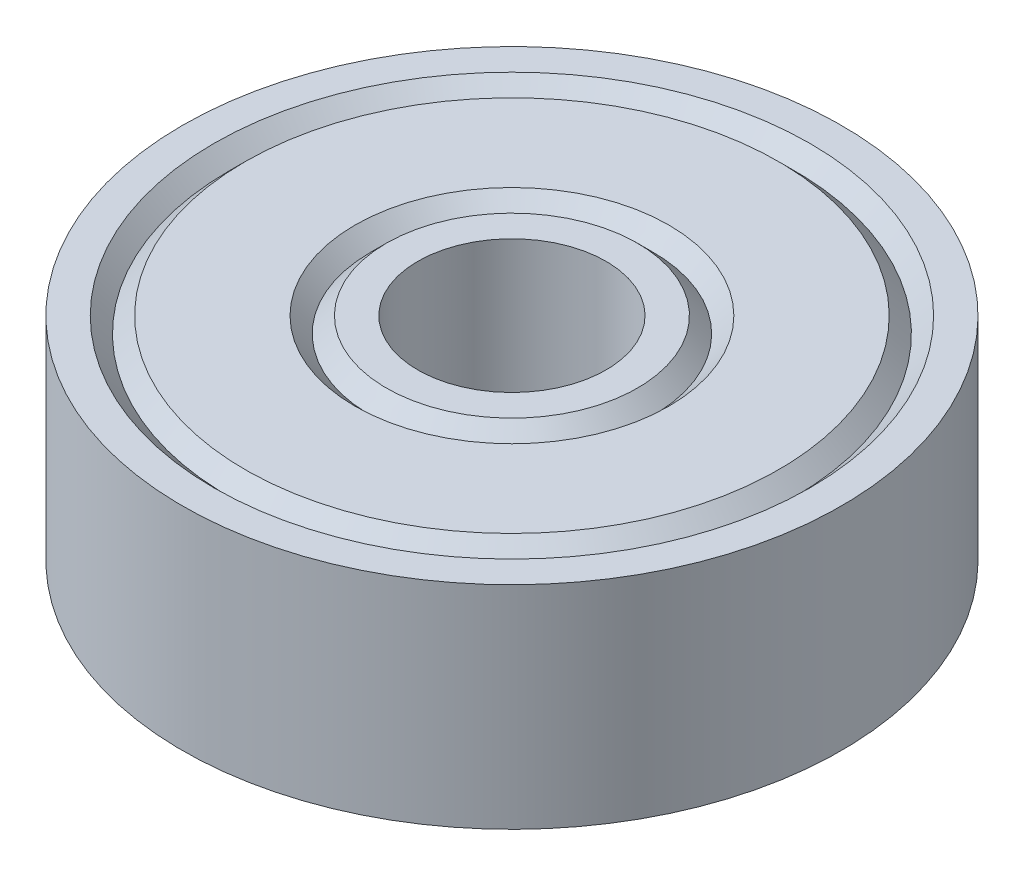
ISO-10303-21;
HEADER;
FILE_DESCRIPTION(('STEP AP214'),'2;1');
FILE_NAME('part.step','',(''),(''),'','','');
FILE_SCHEMA(('AUTOMOTIVE_DESIGN { 1 0 10303 214 1 1 1 1 }'));
ENDSEC;
DATA;
#1=APPLICATION_CONTEXT('core data for automotive mechanical design processes');
#2=APPLICATION_PROTOCOL_DEFINITION('international standard','automotive_design',2000,#1);
#3=PRODUCT_CONTEXT('',#1,'mechanical');
#4=PRODUCT('Part','Part','',(#3));
#5=PRODUCT_RELATED_PRODUCT_CATEGORY('part','',(#4));
#6=PRODUCT_DEFINITION_FORMATION('','',#4);
#7=PRODUCT_DEFINITION_CONTEXT('part definition',#1,'design');
#8=PRODUCT_DEFINITION('design','',#6,#7);
#9=PRODUCT_DEFINITION_SHAPE('','',#8);
#10=(LENGTH_UNIT() NAMED_UNIT(*) SI_UNIT(.MILLI.,.METRE.));
#11=(NAMED_UNIT(*) PLANE_ANGLE_UNIT() SI_UNIT($,.RADIAN.));
#12=(NAMED_UNIT(*) SI_UNIT($,.STERADIAN.) SOLID_ANGLE_UNIT());
#13=UNCERTAINTY_MEASURE_WITH_UNIT(LENGTH_MEASURE(1.E-05),#10,'distance_accuracy_value','');
#14=(GEOMETRIC_REPRESENTATION_CONTEXT(3) GLOBAL_UNCERTAINTY_ASSIGNED_CONTEXT((#13)) GLOBAL_UNIT_ASSIGNED_CONTEXT((#10,
#11,#12)) REPRESENTATION_CONTEXT('',''));
#15=CARTESIAN_POINT('',(0.,0.,0.));
#16=DIRECTION('',(0.,0.,1.));
#17=DIRECTION('',(1.,0.,0.));
#18=AXIS2_PLACEMENT_3D('',#15,#16,#17);
#19=CARTESIAN_POINT('',(0.,4.5,0.));
#20=DIRECTION('',(0.,1.,0.));
#21=DIRECTION('',(-1.,0.,0.));
#22=AXIS2_PLACEMENT_3D('',#19,#20,#21);
#23=CYLINDRICAL_SURFACE('',#22,4.);
#24=CARTESIAN_POINT('',(0.,4.50000000000001,0.));
#25=DIRECTION('',(0.,1.,0.));
#26=DIRECTION('',(-1.,0.,0.));
#27=AXIS2_PLACEMENT_3D('',#24,#25,#26);
#28=CIRCLE('',#27,4.);
#29=CARTESIAN_POINT('',(-4.,4.50000000000001,0.));
#30=VERTEX_POINT('',#29);
#31=EDGE_CURVE('E83',#30,#30,#28,.T.);
#32=ORIENTED_EDGE('',*,*,#31,.T.);
#33=EDGE_LOOP('',(#32));
#34=FACE_BOUND('',#33,.T.);
#35=CARTESIAN_POINT('',(0.,-4.5,0.));
#36=DIRECTION('',(0.,1.,0.));
#37=DIRECTION('',(-1.,0.,0.));
#38=AXIS2_PLACEMENT_3D('',#35,#36,#37);
#39=CIRCLE('',#38,4.);
#40=CARTESIAN_POINT('',(-4.,-4.5,0.));
#41=VERTEX_POINT('',#40);
#42=EDGE_CURVE('E10',#41,#41,#39,.T.);
#43=ORIENTED_EDGE('',*,*,#42,.F.);
#44=EDGE_LOOP('',(#43));
#45=FACE_BOUND('',#44,.T.);
#46=ADVANCED_FACE('F31',(#34,#45),#23,.F.);
#47=CARTESIAN_POINT('',(-4.,-4.5,0.));
#48=DIRECTION('',(0.,-1.,0.));
#49=DIRECTION('',(1.,0.,0.));
#50=AXIS2_PLACEMENT_3D('',#47,#48,#49);
#51=PLANE('',#50);
#52=ORIENTED_EDGE('',*,*,#42,.T.);
#53=EDGE_LOOP('',(#52));
#54=FACE_BOUND('',#53,.T.);
#55=CARTESIAN_POINT('',(0.,-4.49999999999999,0.));
#56=DIRECTION('',(0.,1.,0.));
#57=DIRECTION('',(-1.,0.,0.));
#58=AXIS2_PLACEMENT_3D('',#55,#56,#57);
#59=CIRCLE('',#58,5.33333333333333);
#60=CARTESIAN_POINT('',(-5.33333333333333,-4.49999999999999,0.));
#61=VERTEX_POINT('',#60);
#62=EDGE_CURVE('E37',#61,#61,#59,.T.);
#63=ORIENTED_EDGE('',*,*,#62,.F.);
#64=EDGE_LOOP('',(#63));
#65=FACE_BOUND('',#64,.T.);
#66=ADVANCED_FACE('F101',(#54,#65),#51,.T.);
#67=CARTESIAN_POINT('',(0.,-3.83333333333333,0.));
#68=DIRECTION('',(0.,1.,0.));
#69=DIRECTION('',(-1.,0.,0.));
#70=AXIS2_PLACEMENT_3D('',#67,#68,#69);
#71=CONICAL_SURFACE('',#70,5.99999999999999,0.78539816339745);
#72=ORIENTED_EDGE('',*,*,#62,.T.);
#73=EDGE_LOOP('',(#72));
#74=FACE_BOUND('',#73,.T.);
#75=CARTESIAN_POINT('',(0.,-3.83333333333333,0.));
#76=DIRECTION('',(0.,1.,0.));
#77=DIRECTION('',(-1.,0.,0.));
#78=AXIS2_PLACEMENT_3D('',#75,#76,#77);
#79=CIRCLE('',#78,5.99999999999999);
#80=CARTESIAN_POINT('',(-5.99999999999999,-3.83333333333333,0.));
#81=VERTEX_POINT('',#80);
#82=EDGE_CURVE('E41',#81,#81,#79,.T.);
#83=ORIENTED_EDGE('',*,*,#82,.F.);
#84=EDGE_LOOP('',(#83));
#85=FACE_BOUND('',#84,.T.);
#86=ADVANCED_FACE('F105',(#74,#85),#71,.T.);
#87=CARTESIAN_POINT('',(0.,-4.5,0.));
#88=DIRECTION('',(0.,-1.,0.));
#89=DIRECTION('',(1.,0.,0.));
#90=AXIS2_PLACEMENT_3D('',#87,#88,#89);
#91=CONICAL_SURFACE('',#90,6.66666666666666,0.785398163397448);
#92=ORIENTED_EDGE('',*,*,#82,.T.);
#93=EDGE_LOOP('',(#92));
#94=FACE_BOUND('',#93,.T.);
#95=CARTESIAN_POINT('',(0.,-4.5,0.));
#96=DIRECTION('',(0.,1.,0.));
#97=DIRECTION('',(-1.,0.,0.));
#98=AXIS2_PLACEMENT_3D('',#95,#96,#97);
#99=CIRCLE('',#98,6.66666666666666);
#100=CARTESIAN_POINT('',(-6.66666666666666,-4.5,0.));
#101=VERTEX_POINT('',#100);
#102=EDGE_CURVE('E45',#101,#101,#99,.T.);
#103=ORIENTED_EDGE('',*,*,#102,.F.);
#104=EDGE_LOOP('',(#103));
#105=FACE_BOUND('',#104,.T.);
#106=ADVANCED_FACE('F109',(#94,#105),#91,.F.);
#107=CARTESIAN_POINT('',(-6.66666666666666,-4.5,0.));
#108=DIRECTION('',(0.,-1.,0.));
#109=DIRECTION('',(1.,0.,0.));
#110=AXIS2_PLACEMENT_3D('',#107,#108,#109);
#111=PLANE('',#110);
#112=ORIENTED_EDGE('',*,*,#102,.T.);
#113=EDGE_LOOP('',(#112));
#114=FACE_BOUND('',#113,.T.);
#115=CARTESIAN_POINT('',(0.,-4.50000000000001,0.));
#116=DIRECTION('',(0.,1.,0.));
#117=DIRECTION('',(-1.,0.,0.));
#118=AXIS2_PLACEMENT_3D('',#115,#116,#117);
#119=CIRCLE('',#118,11.3333333333333);
#120=CARTESIAN_POINT('',(-11.3333333333333,-4.50000000000001,0.));
#121=VERTEX_POINT('',#120);
#122=EDGE_CURVE('E50',#121,#121,#119,.T.);
#123=ORIENTED_EDGE('',*,*,#122,.F.);
#124=EDGE_LOOP('',(#123));
#125=FACE_BOUND('',#124,.T.);
#126=ADVANCED_FACE('F115',(#114,#125),#111,.T.);
#127=CARTESIAN_POINT('',(0.,-3.83333333333334,0.));
#128=DIRECTION('',(0.,1.,0.));
#129=DIRECTION('',(-1.,0.,0.));
#130=AXIS2_PLACEMENT_3D('',#127,#128,#129);
#131=CONICAL_SURFACE('',#130,12.,0.785398163397448);
#132=ORIENTED_EDGE('',*,*,#122,.T.);
#133=EDGE_LOOP('',(#132));
#134=FACE_BOUND('',#133,.T.);
#135=CARTESIAN_POINT('',(0.,-3.83333333333334,0.));
#136=DIRECTION('',(0.,1.,0.));
#137=DIRECTION('',(-1.,0.,0.));
#138=AXIS2_PLACEMENT_3D('',#135,#136,#137);
#139=CIRCLE('',#138,12.);
#140=CARTESIAN_POINT('',(-12.,-3.83333333333333,0.));
#141=VERTEX_POINT('',#140);
#142=EDGE_CURVE('E53',#141,#141,#139,.T.);
#143=ORIENTED_EDGE('',*,*,#142,.F.);
#144=EDGE_LOOP('',(#143));
#145=FACE_BOUND('',#144,.T.);
#146=ADVANCED_FACE('F119',(#134,#145),#131,.T.);
#147=CARTESIAN_POINT('',(0.,-4.5,0.));
#148=DIRECTION('',(0.,-1.,0.));
#149=DIRECTION('',(1.,0.,0.));
#150=AXIS2_PLACEMENT_3D('',#147,#148,#149);
#151=CONICAL_SURFACE('',#150,12.6666666666667,0.785398163397446);
#152=ORIENTED_EDGE('',*,*,#142,.T.);
#153=EDGE_LOOP('',(#152));
#154=FACE_BOUND('',#153,.T.);
#155=CARTESIAN_POINT('',(0.,-4.5,0.));
#156=DIRECTION('',(0.,1.,0.));
#157=DIRECTION('',(-1.,0.,0.));
#158=AXIS2_PLACEMENT_3D('',#155,#156,#157);
#159=CIRCLE('',#158,12.6666666666667);
#160=CARTESIAN_POINT('',(-12.6666666666667,-4.5,0.));
#161=VERTEX_POINT('',#160);
#162=EDGE_CURVE('E56',#161,#161,#159,.T.);
#163=ORIENTED_EDGE('',*,*,#162,.F.);
#164=EDGE_LOOP('',(#163));
#165=FACE_BOUND('',#164,.T.);
#166=ADVANCED_FACE('F123',(#154,#165),#151,.F.);
#167=CARTESIAN_POINT('',(-12.6666666666667,-4.5,0.));
#168=DIRECTION('',(0.,-1.,0.));
#169=DIRECTION('',(1.,0.,0.));
#170=AXIS2_PLACEMENT_3D('',#167,#168,#169);
#171=PLANE('',#170);
#172=ORIENTED_EDGE('',*,*,#162,.T.);
#173=EDGE_LOOP('',(#172));
#174=FACE_BOUND('',#173,.T.);
#175=CARTESIAN_POINT('',(0.,-4.5,0.));
#176=DIRECTION('',(0.,1.,0.));
#177=DIRECTION('',(-1.,0.,0.));
#178=AXIS2_PLACEMENT_3D('',#175,#176,#177);
#179=CIRCLE('',#178,14.);
#180=CARTESIAN_POINT('',(-14.,-4.5,0.));
#181=VERTEX_POINT('',#180);
#182=EDGE_CURVE('E59',#181,#181,#179,.T.);
#183=ORIENTED_EDGE('',*,*,#182,.F.);
#184=EDGE_LOOP('',(#183));
#185=FACE_BOUND('',#184,.T.);
#186=ADVANCED_FACE('F127',(#174,#185),#171,.T.);
#187=CARTESIAN_POINT('',(0.,4.5,0.));
#188=DIRECTION('',(0.,1.,0.));
#189=DIRECTION('',(-1.,0.,0.));
#190=AXIS2_PLACEMENT_3D('',#187,#188,#189);
#191=CYLINDRICAL_SURFACE('',#190,14.);
#192=ORIENTED_EDGE('',*,*,#182,.T.);
#193=EDGE_LOOP('',(#192));
#194=FACE_BOUND('',#193,.T.);
#195=CARTESIAN_POINT('',(0.,4.5,0.));
#196=DIRECTION('',(0.,1.,0.));
#197=DIRECTION('',(-1.,0.,0.));
#198=AXIS2_PLACEMENT_3D('',#195,#196,#197);
#199=CIRCLE('',#198,14.);
#200=CARTESIAN_POINT('',(-14.,4.5,0.));
#201=VERTEX_POINT('',#200);
#202=EDGE_CURVE('E62',#201,#201,#199,.T.);
#203=ORIENTED_EDGE('',*,*,#202,.F.);
#204=EDGE_LOOP('',(#203));
#205=FACE_BOUND('',#204,.T.);
#206=ADVANCED_FACE('F131',(#194,#205),#191,.T.);
#207=CARTESIAN_POINT('',(-12.6666666666667,4.5,0.));
#208=DIRECTION('',(0.,1.,0.));
#209=DIRECTION('',(-1.,0.,0.));
#210=AXIS2_PLACEMENT_3D('',#207,#208,#209);
#211=PLANE('',#210);
#212=ORIENTED_EDGE('',*,*,#202,.T.);
#213=EDGE_LOOP('',(#212));
#214=FACE_BOUND('',#213,.T.);
#215=CARTESIAN_POINT('',(0.,4.5,0.));
#216=DIRECTION('',(0.,1.,0.));
#217=DIRECTION('',(-1.,0.,0.));
#218=AXIS2_PLACEMENT_3D('',#215,#216,#217);
#219=CIRCLE('',#218,12.6666666666667);
#220=CARTESIAN_POINT('',(-12.6666666666667,4.5,0.));
#221=VERTEX_POINT('',#220);
#222=EDGE_CURVE('E65',#221,#221,#219,.T.);
#223=ORIENTED_EDGE('',*,*,#222,.F.);
#224=EDGE_LOOP('',(#223));
#225=FACE_BOUND('',#224,.T.);
#226=ADVANCED_FACE('F135',(#214,#225),#211,.T.);
#227=CARTESIAN_POINT('',(0.,3.83333333333333,0.));
#228=DIRECTION('',(0.,1.,0.));
#229=DIRECTION('',(-1.,0.,0.));
#230=AXIS2_PLACEMENT_3D('',#227,#228,#229);
#231=CONICAL_SURFACE('',#230,12.,0.785398163397446);
#232=ORIENTED_EDGE('',*,*,#222,.T.);
#233=EDGE_LOOP('',(#232));
#234=FACE_BOUND('',#233,.T.);
#235=CARTESIAN_POINT('',(0.,3.83333333333333,0.));
#236=DIRECTION('',(0.,1.,0.));
#237=DIRECTION('',(-1.,0.,0.));
#238=AXIS2_PLACEMENT_3D('',#235,#236,#237);
#239=CIRCLE('',#238,12.);
#240=CARTESIAN_POINT('',(-12.,3.83333333333333,0.));
#241=VERTEX_POINT('',#240);
#242=EDGE_CURVE('E68',#241,#241,#239,.T.);
#243=ORIENTED_EDGE('',*,*,#242,.F.);
#244=EDGE_LOOP('',(#243));
#245=FACE_BOUND('',#244,.T.);
#246=ADVANCED_FACE('F139',(#234,#245),#231,.F.);
#247=CARTESIAN_POINT('',(0.,4.50000000000001,0.));
#248=DIRECTION('',(0.,-1.,0.));
#249=DIRECTION('',(1.,0.,0.));
#250=AXIS2_PLACEMENT_3D('',#247,#248,#249);
#251=CONICAL_SURFACE('',#250,11.3333333333333,0.785398163397448);
#252=ORIENTED_EDGE('',*,*,#242,.T.);
#253=EDGE_LOOP('',(#252));
#254=FACE_BOUND('',#253,.T.);
#255=CARTESIAN_POINT('',(0.,4.50000000000001,0.));
#256=DIRECTION('',(0.,1.,0.));
#257=DIRECTION('',(-1.,0.,0.));
#258=AXIS2_PLACEMENT_3D('',#255,#256,#257);
#259=CIRCLE('',#258,11.3333333333333);
#260=CARTESIAN_POINT('',(-11.3333333333333,4.50000000000001,0.));
#261=VERTEX_POINT('',#260);
#262=EDGE_CURVE('E71',#261,#261,#259,.T.);
#263=ORIENTED_EDGE('',*,*,#262,.F.);
#264=EDGE_LOOP('',(#263));
#265=FACE_BOUND('',#264,.T.);
#266=ADVANCED_FACE('F143',(#254,#265),#251,.T.);
#267=CARTESIAN_POINT('',(-6.66666666666666,4.5,0.));
#268=DIRECTION('',(0.,1.,0.));
#269=DIRECTION('',(-1.,0.,0.));
#270=AXIS2_PLACEMENT_3D('',#267,#268,#269);
#271=PLANE('',#270);
#272=ORIENTED_EDGE('',*,*,#262,.T.);
#273=EDGE_LOOP('',(#272));
#274=FACE_BOUND('',#273,.T.);
#275=CARTESIAN_POINT('',(0.,4.5,0.));
#276=DIRECTION('',(0.,1.,0.));
#277=DIRECTION('',(-1.,0.,0.));
#278=AXIS2_PLACEMENT_3D('',#275,#276,#277);
#279=CIRCLE('',#278,6.66666666666666);
#280=CARTESIAN_POINT('',(-6.66666666666666,4.5,0.));
#281=VERTEX_POINT('',#280);
#282=EDGE_CURVE('E74',#281,#281,#279,.T.);
#283=ORIENTED_EDGE('',*,*,#282,.F.);
#284=EDGE_LOOP('',(#283));
#285=FACE_BOUND('',#284,.T.);
#286=ADVANCED_FACE('F147',(#274,#285),#271,.T.);
#287=CARTESIAN_POINT('',(0.,3.83333333333333,0.));
#288=DIRECTION('',(0.,1.,0.));
#289=DIRECTION('',(-1.,0.,0.));
#290=AXIS2_PLACEMENT_3D('',#287,#288,#289);
#291=CONICAL_SURFACE('',#290,6.,0.785398163397449);
#292=ORIENTED_EDGE('',*,*,#282,.T.);
#293=EDGE_LOOP('',(#292));
#294=FACE_BOUND('',#293,.T.);
#295=CARTESIAN_POINT('',(0.,3.83333333333333,0.));
#296=DIRECTION('',(0.,1.,0.));
#297=DIRECTION('',(-1.,0.,0.));
#298=AXIS2_PLACEMENT_3D('',#295,#296,#297);
#299=CIRCLE('',#298,6.);
#300=CARTESIAN_POINT('',(-5.99999999999999,3.83333333333333,0.));
#301=VERTEX_POINT('',#300);
#302=EDGE_CURVE('E77',#301,#301,#299,.T.);
#303=ORIENTED_EDGE('',*,*,#302,.F.);
#304=EDGE_LOOP('',(#303));
#305=FACE_BOUND('',#304,.T.);
#306=ADVANCED_FACE('F97',(#294,#305),#291,.F.);
#307=CARTESIAN_POINT('',(0.,4.5,0.));
#308=DIRECTION('',(0.,-1.,0.));
#309=DIRECTION('',(1.,0.,0.));
#310=AXIS2_PLACEMENT_3D('',#307,#308,#309);
#311=CONICAL_SURFACE('',#310,5.33333333333333,0.785398163397448);
#312=ORIENTED_EDGE('',*,*,#302,.T.);
#313=EDGE_LOOP('',(#312));
#314=FACE_BOUND('',#313,.T.);
#315=CARTESIAN_POINT('',(0.,4.5,0.));
#316=DIRECTION('',(0.,1.,0.));
#317=DIRECTION('',(-1.,0.,0.));
#318=AXIS2_PLACEMENT_3D('',#315,#316,#317);
#319=CIRCLE('',#318,5.33333333333333);
#320=CARTESIAN_POINT('',(-5.33333333333333,4.5,0.));
#321=VERTEX_POINT('',#320);
#322=EDGE_CURVE('E80',#321,#321,#319,.T.);
#323=ORIENTED_EDGE('',*,*,#322,.F.);
#324=EDGE_LOOP('',(#323));
#325=FACE_BOUND('',#324,.T.);
#326=ADVANCED_FACE('F91',(#314,#325),#311,.T.);
#327=CARTESIAN_POINT('',(-4.,4.5,0.));
#328=DIRECTION('',(0.,1.,0.));
#329=DIRECTION('',(-1.,0.,0.));
#330=AXIS2_PLACEMENT_3D('',#327,#328,#329);
#331=PLANE('',#330);
#332=ORIENTED_EDGE('',*,*,#322,.T.);
#333=EDGE_LOOP('',(#332));
#334=FACE_BOUND('',#333,.T.);
#335=ORIENTED_EDGE('',*,*,#31,.F.);
#336=EDGE_LOOP('',(#335));
#337=FACE_BOUND('',#336,.T.);
#338=ADVANCED_FACE('F89',(#334,#337),#331,.T.);
#339=CLOSED_SHELL('',(#46,#66,#86,#106,#126,#146,#166,#186,#206,#226,#246,#266,#286,#306,#326,#338));
#340=MANIFOLD_SOLID_BREP('B2',#339);
#341=ADVANCED_BREP_SHAPE_REPRESENTATION('',(#18,#340),#14);
#342=SHAPE_DEFINITION_REPRESENTATION(#9,#341);
ENDSEC;
END-ISO-10303-21;
